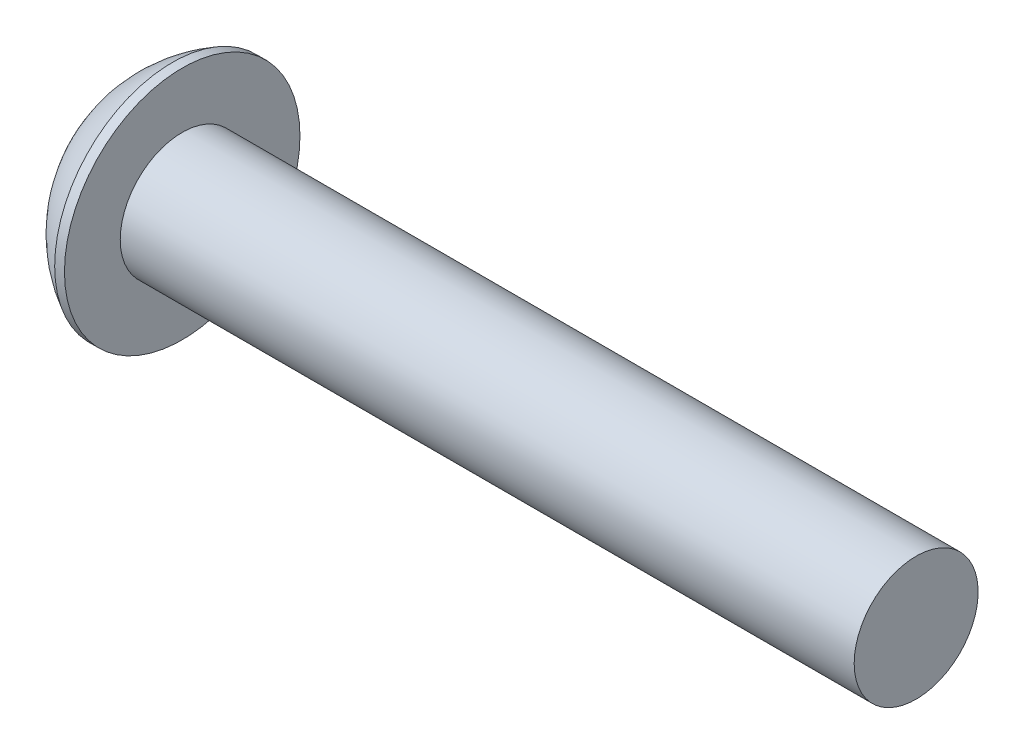
ISO-10303-21;
HEADER;
FILE_DESCRIPTION(('STEP AP214'),'2;1');
FILE_NAME('part.step','',(''),(''),'','','');
FILE_SCHEMA(('AUTOMOTIVE_DESIGN { 1 0 10303 214 1 1 1 1 }'));
ENDSEC;
DATA;
#1=APPLICATION_CONTEXT('core data for automotive mechanical design processes');
#2=APPLICATION_PROTOCOL_DEFINITION('international standard','automotive_design',2000,#1);
#3=PRODUCT_CONTEXT('',#1,'mechanical');
#4=PRODUCT('Part','Part','',(#3));
#5=PRODUCT_RELATED_PRODUCT_CATEGORY('part','',(#4));
#6=PRODUCT_DEFINITION_FORMATION('','',#4);
#7=PRODUCT_DEFINITION_CONTEXT('part definition',#1,'design');
#8=PRODUCT_DEFINITION('design','',#6,#7);
#9=PRODUCT_DEFINITION_SHAPE('','',#8);
#10=(LENGTH_UNIT() NAMED_UNIT(*) SI_UNIT(.MILLI.,.METRE.));
#11=(NAMED_UNIT(*) PLANE_ANGLE_UNIT() SI_UNIT($,.RADIAN.));
#12=(NAMED_UNIT(*) SI_UNIT($,.STERADIAN.) SOLID_ANGLE_UNIT());
#13=UNCERTAINTY_MEASURE_WITH_UNIT(LENGTH_MEASURE(1.E-05),#10,'distance_accuracy_value','');
#14=(GEOMETRIC_REPRESENTATION_CONTEXT(3) GLOBAL_UNCERTAINTY_ASSIGNED_CONTEXT((#13)) GLOBAL_UNIT_ASSIGNED_CONTEXT((#10,
#11,#12)) REPRESENTATION_CONTEXT('',''));
#15=CARTESIAN_POINT('',(0.,0.,0.));
#16=DIRECTION('',(0.,0.,1.));
#17=DIRECTION('',(1.,0.,0.));
#18=AXIS2_PLACEMENT_3D('',#15,#16,#17);
#19=CARTESIAN_POINT('',(-1.82880000000001,0.,0.));
#20=DIRECTION('',(-1.,0.,0.));
#21=DIRECTION('',(0.,0.,1.));
#22=AXIS2_PLACEMENT_3D('',#19,#20,#21);
#23=CONICAL_SURFACE('',#22,1.8288,0.785398163397446);
#24=CARTESIAN_POINT('',(-1.82880000000001,0.,0.));
#25=DIRECTION('',(-1.,0.,0.));
#26=DIRECTION('',(0.,0.,1.));
#27=AXIS2_PLACEMENT_3D('',#24,#25,#26);
#28=CIRCLE('',#27,1.8288);
#29=CARTESIAN_POINT('',(-1.82880000000001,-1.58004822109681,0.920845838894231));
#30=VERTEX_POINT('',#29);
#31=CARTESIAN_POINT('',(-1.82880000000001,-0.00745177890319401,1.82878481812136));
#32=VERTEX_POINT('',#31);
#33=EDGE_CURVE('E244',#30,#32,#28,.T.);
#34=ORIENTED_EDGE('',*,*,#33,.T.);
#35=CARTESIAN_POINT('',(-1.82900000000001,-0.00710296193273345,1.82898620769315));
#36=CARTESIAN_POINT('',(-1.79798176582111,-0.0612413968680546,1.79772936770974));
#37=CARTESIAN_POINT('',(-1.768804762154,-0.116280715119972,1.76595240250098));
#38=CARTESIAN_POINT('',(-1.71541731135211,-0.228486753173012,1.70117021622636));
#39=CARTESIAN_POINT('',(-1.6912359800132,-0.285663770827649,1.66815904969199));
#40=CARTESIAN_POINT('',(-1.64983313923053,-0.400953626097388,1.60159642071718));
#41=CARTESIAN_POINT('',(-1.63250927558265,-0.459038096623036,1.56806133602346));
#42=CARTESIAN_POINT('',(-1.60583796244815,-0.576464657697729,1.50026507937697));
#43=CARTESIAN_POINT('',(-1.59647107247955,-0.635803317985221,1.46600588788664));
#44=CARTESIAN_POINT('',(-1.58800887531627,-0.738427717920976,1.4067556629583));
#45=CARTESIAN_POINT('',(-1.58678086812113,-0.781586520417755,1.38183791671889));
#46=CARTESIAN_POINT('',(-1.58902398395721,-0.867829492194639,1.33204551374779));
#47=CARTESIAN_POINT('',(-1.59249673611106,-0.91091363041643,1.30717087494764));
#48=CARTESIAN_POINT('',(-1.60394206540771,-0.996659819496216,1.25766528960044));
#49=CARTESIAN_POINT('',(-1.61191838302761,-1.0393214894606,1.23303456296242));
#50=CARTESIAN_POINT('',(-1.63193840774461,-1.12392707655171,1.18418750448042));
#51=CARTESIAN_POINT('',(-1.6439838418413,-1.1658706809649,1.15997135318168));
#52=CARTESIAN_POINT('',(-1.67924043571692,-1.27185330769289,1.09878225511086));
#53=CARTESIAN_POINT('',(-1.70494165955475,-1.33527334252756,1.06216668092704));
#54=CARTESIAN_POINT('',(-1.74825503670668,-1.4285641683064,1.00830519755071));
#55=CARTESIAN_POINT('',(-1.76346130507454,-1.45931193774139,0.990552964590433));
#56=CARTESIAN_POINT('',(-1.79524996181871,-1.52025510962339,0.955367407899094));
#57=CARTESIAN_POINT('',(-1.8118317729839,-1.55045073733563,0.937933954111083));
#58=CARTESIAN_POINT('',(-1.82900000000027,-1.58039703806773,0.920644449322171));
#59=B_SPLINE_CURVE_WITH_KNOTS('',3,(#35,#36,#37,#38,#39,#40,#41,#42,#43,#44,#45,#46,#47,#48,#49,
#50,#51,#52,#53,#54,#55,#56,#57,#58),.UNSPECIFIED.,.F.,.F.,(4,2,2,2,2,2,2,2,2,2,2,4),(0.,
0.209500144466995,0.420188843332821,0.627602144749848,0.834507224341982,0.983847288144541,
1.13323912136536,1.28275521623455,1.43233484807212,1.66469982490852,1.78055165650198,
1.89635511741463),.UNSPECIFIED.);
#60=EDGE_CURVE('E214',#32,#30,#59,.T.);
#61=ORIENTED_EDGE('',*,*,#60,.T.);
#62=EDGE_LOOP('',(#34,#61));
#63=FACE_BOUND('',#62,.T.);
#64=ADVANCED_FACE('F41',(#63),#23,.F.);
#65=CARTESIAN_POINT('',(-1.82880000000001,-1.5875,-0.907938979227128));
#66=VERTEX_POINT('',#65);
#67=CARTESIAN_POINT('',(-1.82880000000001,-1.5875,0.907938979227128));
#68=VERTEX_POINT('',#67);
#69=EDGE_CURVE('E275',#66,#68,#28,.T.);
#70=ORIENTED_EDGE('',*,*,#69,.T.);
#71=CARTESIAN_POINT('',(-2.41884583359235,-1.5875,-1.82500929221936));
#72=CARTESIAN_POINT('',(-2.38531276542623,-1.5875,-1.78055818469936));
#73=CARTESIAN_POINT('',(-2.35210936835997,-1.5875,-1.73585907650942));
#74=CARTESIAN_POINT('',(-2.28649794756445,-1.5875,-1.64586427633954));
#75=CARTESIAN_POINT('',(-2.25409012601858,-1.5875,-1.600568437113));
#76=CARTESIAN_POINT('',(-2.15780190494498,-1.5875,-1.46297210215584));
#77=CARTESIAN_POINT('',(-2.09537319757193,-1.5875,-1.36963858857972));
#78=CARTESIAN_POINT('',(-1.97284516161749,-1.5875,-1.1739408617932));
#79=CARTESIAN_POINT('',(-1.91308014332863,-1.5875,-1.07136492019386));
#80=CARTESIAN_POINT('',(-1.80377603992626,-1.5875,-0.861093370178888));
#81=CARTESIAN_POINT('',(-1.75420248563308,-1.5875,-0.753416586787839));
#82=CARTESIAN_POINT('',(-1.69355473541147,-1.5875,-0.59176442890705));
#83=CARTESIAN_POINT('',(-1.67614346878425,-1.5875,-0.540176081947481));
#84=CARTESIAN_POINT('',(-1.64546298974417,-1.5875,-0.435756532214797));
#85=CARTESIAN_POINT('',(-1.63219406350996,-1.5875,-0.382925243842576));
#86=CARTESIAN_POINT('',(-1.61070764570342,-1.5875,-0.277216790300937));
#87=CARTESIAN_POINT('',(-1.60240378593419,-1.5875,-0.224357458354004));
#88=CARTESIAN_POINT('',(-1.59100915058537,-1.5875,-0.118076745851791));
#89=CARTESIAN_POINT('',(-1.58791748493136,-1.5875,-0.0646554628277626));
#90=CARTESIAN_POINT('',(-1.58717534074502,-1.5875,0.0403024254508756));
#91=CARTESIAN_POINT('',(-1.58933324549264,-1.5875,0.091837742427017));
#92=CARTESIAN_POINT('',(-1.59854919060368,-1.5875,0.194465290551352));
#93=CARTESIAN_POINT('',(-1.60560770796995,-1.5875,0.245557478077194));
#94=CARTESIAN_POINT('',(-1.62435975757509,-1.5875,0.347793759019247));
#95=CARTESIAN_POINT('',(-1.63613206364932,-1.5875,0.398923183857681));
#96=CARTESIAN_POINT('',(-1.66368690090293,-1.5875,0.500065247928145));
#97=CARTESIAN_POINT('',(-1.67946909288466,-1.5875,0.55007798123241));
#98=CARTESIAN_POINT('',(-1.73513369416259,-1.5875,0.707672888264433));
#99=CARTESIAN_POINT('',(-1.78136125535134,-1.5875,0.813008430509164));
#100=CARTESIAN_POINT('',(-1.88413869504212,-1.5875,1.01872985181378));
#101=CARTESIAN_POINT('',(-1.94072568595621,-1.5875,1.11909623158762));
#102=CARTESIAN_POINT('',(-2.05746539148359,-1.5875,1.31090882483437));
#103=CARTESIAN_POINT('',(-2.11730100937777,-1.5875,1.40255044446812));
#104=CARTESIAN_POINT('',(-2.20979890181475,-1.5875,1.53756602680818));
#105=CARTESIAN_POINT('',(-2.24095734379018,-1.5875,1.58198845986807));
#106=CARTESIAN_POINT('',(-2.30409778175578,-1.5875,1.67022633905771));
#107=CARTESIAN_POINT('',(-2.33607954894282,-1.5875,1.71404194872823));
#108=CARTESIAN_POINT('',(-2.36840270150048,-1.5875,1.75760493469799));
#109=B_SPLINE_CURVE_WITH_KNOTS('',3,(#71,#72,#73,#74,#75,#76,#77,#78,#79,#80,#81,#82,#83,#84,
#85,#86,#87,#88,#89,#90,#91,#92,#93,#94,#95,#96,#97,#98,#99,#100,#101,#102,#103,#104,#105,#106,
#107,#108),.UNSPECIFIED.,.F.,.F.,(4,2,2,2,2,2,2,2,2,2,2,2,2,2,2,2,2,2,4),(0.,0.167038582206584,
0.33411918424497,0.670830460170841,1.0266880706705,1.38132155981881,1.54452529826255,
1.70774030934245,1.86802667313751,2.02828566242478,2.18278328824718,2.33729595425851,
2.49450635071892,2.65170345312208,2.99578906555957,3.34113237629954,3.66930816833921,
3.83208342752259,3.99481392942941),.UNSPECIFIED.);
#110=EDGE_CURVE('E223',#68,#66,#109,.F.);
#111=ORIENTED_EDGE('',*,*,#110,.T.);
#112=EDGE_LOOP('',(#70,#111));
#113=FACE_BOUND('',#112,.T.);
#114=ADVANCED_FACE('F295',(#113),#23,.F.);
#115=CARTESIAN_POINT('',(-1.82880000000001,-0.00745177890319544,-1.82878481812136));
#116=VERTEX_POINT('',#115);
#117=CARTESIAN_POINT('',(-1.82880000000001,-1.5800482210968,-0.920845838894231));
#118=VERTEX_POINT('',#117);
#119=EDGE_CURVE('E267',#116,#118,#28,.T.);
#120=ORIENTED_EDGE('',*,*,#119,.T.);
#121=CARTESIAN_POINT('',(-1.82900000000027,-1.58039703806773,-0.92064444932217));
#122=CARTESIAN_POINT('',(-1.79798176582135,-1.52625860313238,-0.951901289305598));
#123=CARTESIAN_POINT('',(-1.76880476215421,-1.47121928488044,-0.983678254514372));
#124=CARTESIAN_POINT('',(-1.71541731135227,-1.35901324682734,-1.04846044078903));
#125=CARTESIAN_POINT('',(-1.69123598001333,-1.30183622917267,-1.08147160732341));
#126=CARTESIAN_POINT('',(-1.64983313923061,-1.18654637390287,-1.14803423629826));
#127=CARTESIAN_POINT('',(-1.63250927558271,-1.12846190337719,-1.181569320992));
#128=CARTESIAN_POINT('',(-1.60583796244818,-1.01103534230243,-1.24936557763853));
#129=CARTESIAN_POINT('',(-1.59647107247956,-0.951696682014903,-1.28362476912888));
#130=CARTESIAN_POINT('',(-1.58800887531627,-0.849072282079112,-1.34287499405724));
#131=CARTESIAN_POINT('',(-1.58678086812113,-0.805913479582333,-1.36779274029665));
#132=CARTESIAN_POINT('',(-1.58902398395721,-0.719670507805445,-1.41758514326775));
#133=CARTESIAN_POINT('',(-1.59249673611105,-0.676586369583652,-1.44245978206791));
#134=CARTESIAN_POINT('',(-1.6039420654077,-0.590840180503863,-1.49196536741511));
#135=CARTESIAN_POINT('',(-1.6119183830276,-0.548178510539482,-1.51659609405312));
#136=CARTESIAN_POINT('',(-1.63193840774459,-0.463572923448364,-1.56544315253513));
#137=CARTESIAN_POINT('',(-1.64398384184128,-0.42162931903517,-1.58965930383387));
#138=CARTESIAN_POINT('',(-1.67924043571687,-0.315646692307252,-1.65084840190465));
#139=CARTESIAN_POINT('',(-1.70494165955467,-0.252226657472646,-1.68746397608843));
#140=CARTESIAN_POINT('',(-1.74825503670654,-0.158935831693912,-1.7413254594647));
#141=CARTESIAN_POINT('',(-1.76346130507437,-0.128188062258946,-1.75907769242496));
#142=CARTESIAN_POINT('',(-1.79524996181849,-0.0672448903770135,-1.79426324911627));
#143=CARTESIAN_POINT('',(-1.81183177298366,-0.0370492626648058,-1.81169670290426));
#144=CARTESIAN_POINT('',(-1.82900000000001,-0.00710296193273376,-1.82898620769315));
#145=B_SPLINE_CURVE_WITH_KNOTS('',3,(#121,#122,#123,#124,#125,#126,#127,#128,#129,#130,#131,
#132,#133,#134,#135,#136,#137,#138,#139,#140,#141,#142,#143,#144),.UNSPECIFIED.,.F.,.F.,(4,2,2,
2,2,2,2,2,2,2,2,4),(0.,0.209500144467117,0.420188843333067,0.627602144750218,0.834507224342474,
0.983847288145038,1.13323912136587,1.28275521623506,1.43233484807263,1.66469982490878,
1.78055165650211,1.89635511741463),.UNSPECIFIED.);
#146=EDGE_CURVE('E273',#118,#116,#145,.T.);
#147=ORIENTED_EDGE('',*,*,#146,.T.);
#148=EDGE_LOOP('',(#120,#147));
#149=FACE_BOUND('',#148,.T.);
#150=ADVANCED_FACE('F272',(#149),#23,.F.);
#151=CARTESIAN_POINT('',(-1.82880000000001,1.5800482210968,-0.920845838894232));
#152=VERTEX_POINT('',#151);
#153=CARTESIAN_POINT('',(-1.82880000000001,0.00745177890319596,-1.82878481812136));
#154=VERTEX_POINT('',#153);
#155=EDGE_CURVE('E274',#152,#154,#28,.T.);
#156=ORIENTED_EDGE('',*,*,#155,.T.);
#157=CARTESIAN_POINT('',(-1.82900000000001,0.00710296193273401,-1.82898620769315));
#158=CARTESIAN_POINT('',(-1.79798176582111,0.0612413968680552,-1.79772936770974));
#159=CARTESIAN_POINT('',(-1.768804762154,0.116280715119972,-1.76595240250098));
#160=CARTESIAN_POINT('',(-1.71541731135211,0.228486753173013,-1.70117021622636));
#161=CARTESIAN_POINT('',(-1.6912359800132,0.28566377082765,-1.66815904969199));
#162=CARTESIAN_POINT('',(-1.64983313923053,0.40095362609739,-1.60159642071718));
#163=CARTESIAN_POINT('',(-1.63250927558265,0.459038096623037,-1.56806133602346));
#164=CARTESIAN_POINT('',(-1.60583796244815,0.57646465769773,-1.50026507937697));
#165=CARTESIAN_POINT('',(-1.59647107247955,0.635803317985223,-1.46600588788664));
#166=CARTESIAN_POINT('',(-1.58800887531627,0.738427717920978,-1.4067556629583));
#167=CARTESIAN_POINT('',(-1.58678086812113,0.781586520417756,-1.38183791671889));
#168=CARTESIAN_POINT('',(-1.58902398395721,0.86782949219464,-1.33204551374779));
#169=CARTESIAN_POINT('',(-1.59249673611106,0.910913630416431,-1.30717087494764));
#170=CARTESIAN_POINT('',(-1.60394206540771,0.996659819496218,-1.25766528960044));
#171=CARTESIAN_POINT('',(-1.61191838302761,1.0393214894606,-1.23303456296242));
#172=CARTESIAN_POINT('',(-1.63193840774461,1.12392707655171,-1.18418750448042));
#173=CARTESIAN_POINT('',(-1.6439838418413,1.1658706809649,-1.15997135318168));
#174=CARTESIAN_POINT('',(-1.67924043571692,1.27185330769289,-1.09878225511085));
#175=CARTESIAN_POINT('',(-1.70494165955476,1.33527334252757,-1.06216668092704));
#176=CARTESIAN_POINT('',(-1.74825503670668,1.4285641683064,-1.00830519755071));
#177=CARTESIAN_POINT('',(-1.76346130507454,1.45931193774139,-0.990552964590433));
#178=CARTESIAN_POINT('',(-1.79524996181871,1.52025510962339,-0.955367407899094));
#179=CARTESIAN_POINT('',(-1.8118317729839,1.55045073733563,-0.937933954111083));
#180=CARTESIAN_POINT('',(-1.82900000000027,1.58039703806773,-0.920644449322171));
#181=B_SPLINE_CURVE_WITH_KNOTS('',3,(#157,#158,#159,#160,#161,#162,#163,#164,#165,#166,#167,
#168,#169,#170,#171,#172,#173,#174,#175,#176,#177,#178,#179,#180),.UNSPECIFIED.,.F.,.F.,(4,2,2,
2,2,2,2,2,2,2,2,4),(0.,0.209500144466995,0.420188843332822,0.627602144749849,0.834507224341983,
0.983847288144542,1.13323912136536,1.28275521623455,1.43233484807213,1.66469982490853,
1.78055165650198,1.89635511741463),.UNSPECIFIED.);
#182=EDGE_CURVE('E310',#154,#152,#181,.T.);
#183=ORIENTED_EDGE('',*,*,#182,.T.);
#184=EDGE_LOOP('',(#156,#183));
#185=FACE_BOUND('',#184,.T.);
#186=ADVANCED_FACE('F292',(#185),#23,.F.);
#187=CARTESIAN_POINT('',(-1.82880000000001,1.5875,0.907938979227128));
#188=VERTEX_POINT('',#187);
#189=CARTESIAN_POINT('',(-1.82880000000001,1.5875,-0.907938979227127));
#190=VERTEX_POINT('',#189);
#191=EDGE_CURVE('E248',#188,#190,#28,.T.);
#192=ORIENTED_EDGE('',*,*,#191,.T.);
#193=CARTESIAN_POINT('',(-2.41884583359235,1.5875,-1.82500929221937));
#194=CARTESIAN_POINT('',(-2.38531276542623,1.5875,-1.78055818469936));
#195=CARTESIAN_POINT('',(-2.35210936835997,1.5875,-1.73585907650943));
#196=CARTESIAN_POINT('',(-2.28649794756445,1.5875,-1.64586427633954));
#197=CARTESIAN_POINT('',(-2.25409012601858,1.5875,-1.600568437113));
#198=CARTESIAN_POINT('',(-2.15780190494498,1.5875,-1.46297210215584));
#199=CARTESIAN_POINT('',(-2.09537319757193,1.5875,-1.36963858857972));
#200=CARTESIAN_POINT('',(-1.97284516161749,1.5875,-1.1739408617932));
#201=CARTESIAN_POINT('',(-1.91308014332863,1.5875,-1.07136492019386));
#202=CARTESIAN_POINT('',(-1.80377603992627,1.5875,-0.86109337017889));
#203=CARTESIAN_POINT('',(-1.75420248563308,1.5875,-0.75341658678784));
#204=CARTESIAN_POINT('',(-1.69355473541147,1.5875,-0.591764428907051));
#205=CARTESIAN_POINT('',(-1.67614346878425,1.5875,-0.540176081947481));
#206=CARTESIAN_POINT('',(-1.64546298974417,1.5875,-0.435756532214797));
#207=CARTESIAN_POINT('',(-1.63219406350996,1.5875,-0.382925243842576));
#208=CARTESIAN_POINT('',(-1.61070764570342,1.5875,-0.277216790300937));
#209=CARTESIAN_POINT('',(-1.60240378593419,1.5875,-0.224357458354004));
#210=CARTESIAN_POINT('',(-1.59100915058537,1.5875,-0.118076745851792));
#211=CARTESIAN_POINT('',(-1.58791748493136,1.5875,-0.0646554628277632));
#212=CARTESIAN_POINT('',(-1.58717534074502,1.5875,0.0403024254508752));
#213=CARTESIAN_POINT('',(-1.58933324549264,1.5875,0.0918377424270167));
#214=CARTESIAN_POINT('',(-1.59854919060368,1.5875,0.194465290551352));
#215=CARTESIAN_POINT('',(-1.60560770796995,1.5875,0.245557478077193));
#216=CARTESIAN_POINT('',(-1.62435975757509,1.5875,0.347793759019247));
#217=CARTESIAN_POINT('',(-1.63613206364932,1.5875,0.39892318385768));
#218=CARTESIAN_POINT('',(-1.66368690090293,1.5875,0.500065247928144));
#219=CARTESIAN_POINT('',(-1.67946909288466,1.5875,0.55007798123241));
#220=CARTESIAN_POINT('',(-1.73513369416259,1.5875,0.707672888264433));
#221=CARTESIAN_POINT('',(-1.78136125535134,1.5875,0.813008430509163));
#222=CARTESIAN_POINT('',(-1.88413869504212,1.5875,1.01872985181378));
#223=CARTESIAN_POINT('',(-1.94072568595621,1.5875,1.11909623158762));
#224=CARTESIAN_POINT('',(-2.05746539148359,1.5875,1.31090882483437));
#225=CARTESIAN_POINT('',(-2.11730100937777,1.5875,1.40255044446812));
#226=CARTESIAN_POINT('',(-2.20979890181475,1.5875,1.53756602680818));
#227=CARTESIAN_POINT('',(-2.24095734379018,1.5875,1.58198845986807));
#228=CARTESIAN_POINT('',(-2.30409778175578,1.5875,1.67022633905771));
#229=CARTESIAN_POINT('',(-2.33607954894282,1.5875,1.71404194872823));
#230=CARTESIAN_POINT('',(-2.36840270150048,1.5875,1.75760493469799));
#231=B_SPLINE_CURVE_WITH_KNOTS('',3,(#193,#194,#195,#196,#197,#198,#199,#200,#201,#202,#203,
#204,#205,#206,#207,#208,#209,#210,#211,#212,#213,#214,#215,#216,#217,#218,#219,#220,#221,#222,
#223,#224,#225,#226,#227,#228,#229,#230),.UNSPECIFIED.,.F.,.F.,(4,2,2,2,2,2,2,2,2,2,2,2,2,2,2,2,
2,2,4),(0.,0.167038582206583,0.334119184244971,0.670830460170842,1.0266880706705,
1.38132155981881,1.54452529826255,1.70774030934245,1.86802667313751,2.02828566242479,
2.18278328824719,2.33729595425851,2.49450635071892,2.65170345312209,2.99578906555957,
3.34113237629954,3.66930816833921,3.83208342752259,3.99481392942941),.UNSPECIFIED.);
#232=EDGE_CURVE('E194',#190,#188,#231,.T.);
#233=ORIENTED_EDGE('',*,*,#232,.T.);
#234=EDGE_LOOP('',(#192,#233));
#235=FACE_BOUND('',#234,.T.);
#236=ADVANCED_FACE('F286',(#235),#23,.F.);
#237=CARTESIAN_POINT('',(-1.82880000000001,0.00745177890319537,1.82878481812136));
#238=VERTEX_POINT('',#237);
#239=CARTESIAN_POINT('',(-1.82880000000001,1.58004822109681,0.920845838894231));
#240=VERTEX_POINT('',#239);
#241=EDGE_CURVE('E245',#238,#240,#28,.T.);
#242=ORIENTED_EDGE('',*,*,#241,.T.);
#243=CARTESIAN_POINT('',(-1.82900000000027,1.58039703806773,0.92064444932217));
#244=CARTESIAN_POINT('',(-1.79798176582135,1.52625860313238,0.951901289305598));
#245=CARTESIAN_POINT('',(-1.76880476215421,1.47121928488044,0.983678254514371));
#246=CARTESIAN_POINT('',(-1.71541731135227,1.35901324682734,1.04846044078903));
#247=CARTESIAN_POINT('',(-1.69123598001333,1.30183622917267,1.08147160732341));
#248=CARTESIAN_POINT('',(-1.64983313923061,1.18654637390287,1.14803423629826));
#249=CARTESIAN_POINT('',(-1.63250927558271,1.12846190337719,1.181569320992));
#250=CARTESIAN_POINT('',(-1.60583796244818,1.01103534230243,1.24936557763853));
#251=CARTESIAN_POINT('',(-1.59647107247956,0.951696682014904,1.28362476912888));
#252=CARTESIAN_POINT('',(-1.58800887531627,0.849072282079113,1.34287499405724));
#253=CARTESIAN_POINT('',(-1.58678086812113,0.805913479582333,1.36779274029665));
#254=CARTESIAN_POINT('',(-1.58902398395721,0.719670507805446,1.41758514326775));
#255=CARTESIAN_POINT('',(-1.59249673611105,0.676586369583653,1.44245978206791));
#256=CARTESIAN_POINT('',(-1.6039420654077,0.590840180503864,1.49196536741511));
#257=CARTESIAN_POINT('',(-1.6119183830276,0.548178510539483,1.51659609405312));
#258=CARTESIAN_POINT('',(-1.63193840774459,0.463572923448365,1.56544315253513));
#259=CARTESIAN_POINT('',(-1.64398384184128,0.421629319035171,1.58965930383387));
#260=CARTESIAN_POINT('',(-1.67924043571687,0.315646692307252,1.65084840190465));
#261=CARTESIAN_POINT('',(-1.70494165955467,0.252226657472647,1.68746397608843));
#262=CARTESIAN_POINT('',(-1.74825503670654,0.158935831693913,1.7413254594647));
#263=CARTESIAN_POINT('',(-1.76346130507437,0.128188062258947,1.75907769242496));
#264=CARTESIAN_POINT('',(-1.79524996181849,0.0672448903770139,1.79426324911627));
#265=CARTESIAN_POINT('',(-1.81183177298366,0.0370492626648061,1.81169670290426));
#266=CARTESIAN_POINT('',(-1.82900000000001,0.00710296193273415,1.82898620769315));
#267=B_SPLINE_CURVE_WITH_KNOTS('',3,(#243,#244,#245,#246,#247,#248,#249,#250,#251,#252,#253,
#254,#255,#256,#257,#258,#259,#260,#261,#262,#263,#264,#265,#266),.UNSPECIFIED.,.F.,.F.,(4,2,2,
2,2,2,2,2,2,2,2,4),(0.,0.209500144467116,0.420188843333066,0.627602144750218,0.834507224342473,
0.983847288145037,1.13323912136587,1.28275521623506,1.43233484807263,1.66469982490878,
1.78055165650211,1.89635511741463),.UNSPECIFIED.);
#268=EDGE_CURVE('E176',#240,#238,#267,.T.);
#269=ORIENTED_EDGE('',*,*,#268,.T.);
#270=EDGE_LOOP('',(#242,#269));
#271=FACE_BOUND('',#270,.T.);
#272=ADVANCED_FACE('F43',(#271),#23,.F.);
#273=CARTESIAN_POINT('',(-1.82880000000001,2.413,0.));
#274=DIRECTION('',(1.,0.,0.));
#275=DIRECTION('',(0.,0.,-1.));
#276=AXIS2_PLACEMENT_3D('',#273,#274,#275);
#277=PLANE('',#276);
#278=ORIENTED_EDGE('',*,*,#33,.F.);
#279=DIRECTION('',(0.,0.866025403784439,0.5));
#280=VECTOR('',#279,1.);
#281=CARTESIAN_POINT('',(-1.82880000000001,-1.5875,0.91654355233853));
#282=LINE('',#281,#280);
#283=CARTESIAN_POINT('',(-1.82880000000001,-1.5875,0.91654355233853));
#284=VERTEX_POINT('',#283);
#285=EDGE_CURVE('E165',#284,#30,#282,.T.);
#286=ORIENTED_EDGE('',*,*,#285,.F.);
#287=DIRECTION('',(0.,0.,-1.));
#288=VECTOR('',#287,1.);
#289=CARTESIAN_POINT('',(-1.82880000000001,-1.5875,0.));
#290=LINE('',#289,#288);
#291=EDGE_CURVE('E11',#284,#68,#290,.T.);
#292=ORIENTED_EDGE('',*,*,#291,.T.);
#293=ORIENTED_EDGE('',*,*,#69,.F.);
#294=DIRECTION('',(0.,0.,1.));
#295=VECTOR('',#294,1.);
#296=CARTESIAN_POINT('',(-1.82880000000001,-1.5875,-0.91654355233853));
#297=LINE('',#296,#295);
#298=CARTESIAN_POINT('',(-1.82880000000001,-1.5875,-0.91654355233853));
#299=VERTEX_POINT('',#298);
#300=EDGE_CURVE('E153',#299,#66,#297,.T.);
#301=ORIENTED_EDGE('',*,*,#300,.F.);
#302=DIRECTION('',(0.,0.866025403784439,-0.5));
#303=VECTOR('',#302,1.);
#304=CARTESIAN_POINT('',(-1.82880000000001,1.016,-2.41967497817372));
#305=LINE('',#304,#303);
#306=EDGE_CURVE('E50',#299,#118,#305,.T.);
#307=ORIENTED_EDGE('',*,*,#306,.T.);
#308=ORIENTED_EDGE('',*,*,#119,.F.);
#309=DIRECTION('',(0.,-0.866025403784438,0.5));
#310=VECTOR('',#309,1.);
#311=CARTESIAN_POINT('',(-1.82880000000001,0.,-1.83308710467706));
#312=LINE('',#311,#310);
#313=CARTESIAN_POINT('',(-1.82880000000001,0.,-1.83308710467706));
#314=VERTEX_POINT('',#313);
#315=EDGE_CURVE('E155',#314,#116,#312,.T.);
#316=ORIENTED_EDGE('',*,*,#315,.F.);
#317=DIRECTION('',(0.,0.866025403784439,0.5));
#318=VECTOR('',#317,1.);
#319=CARTESIAN_POINT('',(-1.82880000000001,2.6035,-0.329955678841872));
#320=LINE('',#319,#318);
#321=EDGE_CURVE('E256',#314,#154,#320,.T.);
#322=ORIENTED_EDGE('',*,*,#321,.T.);
#323=ORIENTED_EDGE('',*,*,#155,.F.);
#324=DIRECTION('',(0.,-0.866025403784438,-0.5));
#325=VECTOR('',#324,1.);
#326=CARTESIAN_POINT('',(-1.82880000000001,1.5875,-0.91654355233853));
#327=LINE('',#326,#325);
#328=CARTESIAN_POINT('',(-1.82880000000001,1.5875,-0.91654355233853));
#329=VERTEX_POINT('',#328);
#330=EDGE_CURVE('E171',#329,#152,#327,.T.);
#331=ORIENTED_EDGE('',*,*,#330,.F.);
#332=DIRECTION('',(0.,0.,1.));
#333=VECTOR('',#332,1.);
#334=CARTESIAN_POINT('',(-1.82880000000001,1.5875,0.));
#335=LINE('',#334,#333);
#336=EDGE_CURVE('E252',#329,#190,#335,.T.);
#337=ORIENTED_EDGE('',*,*,#336,.T.);
#338=ORIENTED_EDGE('',*,*,#191,.F.);
#339=DIRECTION('',(0.,0.,-1.));
#340=VECTOR('',#339,1.);
#341=CARTESIAN_POINT('',(-1.82880000000001,1.5875,0.91654355233853));
#342=LINE('',#341,#340);
#343=CARTESIAN_POINT('',(-1.82880000000001,1.5875,0.91654355233853));
#344=VERTEX_POINT('',#343);
#345=EDGE_CURVE('E169',#344,#188,#342,.T.);
#346=ORIENTED_EDGE('',*,*,#345,.F.);
#347=DIRECTION('',(0.,-0.866025403784438,0.5));
#348=VECTOR('',#347,1.);
#349=CARTESIAN_POINT('',(-1.82880000000001,2.6035,0.329955678841871));
#350=LINE('',#349,#348);
#351=EDGE_CURVE('E249',#344,#240,#350,.T.);
#352=ORIENTED_EDGE('',*,*,#351,.T.);
#353=ORIENTED_EDGE('',*,*,#241,.F.);
#354=DIRECTION('',(0.,0.866025403784438,-0.5));
#355=VECTOR('',#354,1.);
#356=CARTESIAN_POINT('',(-1.82880000000001,0.,1.83308710467706));
#357=LINE('',#356,#355);
#358=CARTESIAN_POINT('',(-1.82880000000001,0.,1.83308710467706));
#359=VERTEX_POINT('',#358);
#360=EDGE_CURVE('E167',#359,#238,#357,.T.);
#361=ORIENTED_EDGE('',*,*,#360,.F.);
#362=DIRECTION('',(0.,-0.866025403784439,-0.5));
#363=VECTOR('',#362,1.);
#364=CARTESIAN_POINT('',(-1.82880000000001,1.016,2.41967497817372));
#365=LINE('',#364,#363);
#366=EDGE_CURVE('E136',#359,#32,#365,.T.);
#367=ORIENTED_EDGE('',*,*,#366,.T.);
#368=EDGE_LOOP('',(#278,#286,#292,#293,#301,#307,#308,#316,#322,#323,#331,#337,#338,#346,#352,
#353,#361,#367));
#369=FACE_BOUND('',#368,.T.);
#370=CARTESIAN_POINT('',(-1.82880000000001,0.,0.));
#371=DIRECTION('',(-1.,0.,0.));
#372=DIRECTION('',(0.,0.,1.));
#373=AXIS2_PLACEMENT_3D('',#370,#371,#372);
#374=CIRCLE('',#373,2.413);
#375=CARTESIAN_POINT('',(-1.82880000000001,0.,2.413));
#376=VERTEX_POINT('',#375);
#377=EDGE_CURVE('E241',#376,#376,#374,.T.);
#378=ORIENTED_EDGE('',*,*,#377,.T.);
#379=EDGE_LOOP('',(#378));
#380=FACE_BOUND('',#379,.T.);
#381=ADVANCED_FACE('F264',(#369,#380),#277,.F.);
#382=CARTESIAN_POINT('',(2.75154317616325,0.,0.));
#383=DIRECTION('',(-1.,0.,0.));
#384=DIRECTION('',(0.,0.,1.));
#385=AXIS2_PLACEMENT_3D('',#382,#383,#384);
#386=DEGENERATE_TOROIDAL_SURFACE('',#385,0.00969167426947842,5.1816,.F.);
#387=ORIENTED_EDGE('',*,*,#377,.F.);
#388=EDGE_LOOP('',(#387));
#389=FACE_BOUND('',#388,.T.);
#390=CARTESIAN_POINT('',(0.355599999999993,0.,0.));
#391=DIRECTION('',(-1.,0.,0.));
#392=DIRECTION('',(0.,0.,1.));
#393=AXIS2_PLACEMENT_3D('',#390,#391,#392);
#394=CIRCLE('',#393,4.5847);
#395=CARTESIAN_POINT('',(0.355599999999993,0.,4.5847));
#396=VERTEX_POINT('',#395);
#397=EDGE_CURVE('E238',#396,#396,#394,.T.);
#398=ORIENTED_EDGE('',*,*,#397,.T.);
#399=EDGE_LOOP('',(#398));
#400=FACE_BOUND('',#399,.T.);
#401=ADVANCED_FACE('F291',(#389,#400),#386,.F.);
#402=CARTESIAN_POINT('',(0.,0.,0.));
#403=DIRECTION('',(-1.,0.,0.));
#404=DIRECTION('',(0.,0.,1.));
#405=AXIS2_PLACEMENT_3D('',#402,#403,#404);
#406=CYLINDRICAL_SURFACE('',#405,4.5847);
#407=ORIENTED_EDGE('',*,*,#397,.F.);
#408=EDGE_LOOP('',(#407));
#409=FACE_BOUND('',#408,.T.);
#410=CARTESIAN_POINT('',(0.736599999999993,0.,0.));
#411=DIRECTION('',(-1.,0.,0.));
#412=DIRECTION('',(0.,0.,1.));
#413=AXIS2_PLACEMENT_3D('',#410,#411,#412);
#414=CIRCLE('',#413,4.5847);
#415=CARTESIAN_POINT('',(0.736599999999993,0.,4.5847));
#416=VERTEX_POINT('',#415);
#417=EDGE_CURVE('E235',#416,#416,#414,.T.);
#418=ORIENTED_EDGE('',*,*,#417,.T.);
#419=EDGE_LOOP('',(#418));
#420=FACE_BOUND('',#419,.T.);
#421=ADVANCED_FACE('F389',(#409,#420),#406,.T.);
#422=CARTESIAN_POINT('',(0.736599999999993,2.413,0.));
#423=DIRECTION('',(-1.,0.,0.));
#424=DIRECTION('',(0.,0.,1.));
#425=AXIS2_PLACEMENT_3D('',#422,#423,#424);
#426=PLANE('',#425);
#427=ORIENTED_EDGE('',*,*,#417,.F.);
#428=EDGE_LOOP('',(#427));
#429=FACE_BOUND('',#428,.T.);
#430=CARTESIAN_POINT('',(0.736599999999993,0.,0.));
#431=DIRECTION('',(-1.,0.,0.));
#432=DIRECTION('',(0.,0.,1.));
#433=AXIS2_PLACEMENT_3D('',#430,#431,#432);
#434=CIRCLE('',#433,2.413);
#435=CARTESIAN_POINT('',(0.736599999999993,0.,2.413));
#436=VERTEX_POINT('',#435);
#437=EDGE_CURVE('E232',#436,#436,#434,.T.);
#438=ORIENTED_EDGE('',*,*,#437,.T.);
#439=EDGE_LOOP('',(#438));
#440=FACE_BOUND('',#439,.T.);
#441=ADVANCED_FACE('F382',(#429,#440),#426,.F.);
#442=CARTESIAN_POINT('',(0.,0.,0.));
#443=DIRECTION('',(-1.,0.,0.));
#444=DIRECTION('',(0.,0.,1.));
#445=AXIS2_PLACEMENT_3D('',#442,#443,#444);
#446=CYLINDRICAL_SURFACE('',#445,2.413);
#447=ORIENTED_EDGE('',*,*,#437,.F.);
#448=EDGE_LOOP('',(#447));
#449=FACE_BOUND('',#448,.T.);
#450=CARTESIAN_POINT('',(29.3116,0.,0.));
#451=DIRECTION('',(-1.,0.,0.));
#452=DIRECTION('',(0.,0.,1.));
#453=AXIS2_PLACEMENT_3D('',#450,#451,#452);
#454=CIRCLE('',#453,2.413);
#455=CARTESIAN_POINT('',(29.3116,0.,2.413));
#456=VERTEX_POINT('',#455);
#457=EDGE_CURVE('E222',#456,#456,#454,.T.);
#458=ORIENTED_EDGE('',*,*,#457,.T.);
#459=EDGE_LOOP('',(#458));
#460=FACE_BOUND('',#459,.T.);
#461=ADVANCED_FACE('F374',(#449,#460),#446,.T.);
#462=CARTESIAN_POINT('',(29.3116,0.,0.));
#463=DIRECTION('',(-1.,0.,0.));
#464=DIRECTION('',(0.,0.,1.));
#465=AXIS2_PLACEMENT_3D('',#462,#463,#464);
#466=PLANE('',#465);
#467=ORIENTED_EDGE('',*,*,#457,.F.);
#468=EDGE_LOOP('',(#467));
#469=FACE_BOUND('',#468,.T.);
#470=ADVANCED_FACE('F211',(#469),#466,.F.);
#471=CARTESIAN_POINT('',(0.,-1.5875,0.91654355233853));
#472=DIRECTION('',(0.,-0.5,0.866025403784439));
#473=DIRECTION('',(0.,-0.866025403784439,-0.5));
#474=AXIS2_PLACEMENT_3D('',#471,#472,#473);
#475=PLANE('',#474);
#476=ORIENTED_EDGE('',*,*,#366,.F.);
#477=DIRECTION('',(-1.,0.,0.));
#478=VECTOR('',#477,1.);
#479=CARTESIAN_POINT('',(0.,0.,1.83308710467706));
#480=LINE('',#479,#478);
#481=CARTESIAN_POINT('',(0.,0.,1.83308710467706));
#482=VERTEX_POINT('',#481);
#483=EDGE_CURVE('E57',#482,#359,#480,.T.);
#484=ORIENTED_EDGE('',*,*,#483,.F.);
#485=DIRECTION('',(0.,0.866025403784439,0.5));
#486=VECTOR('',#485,1.);
#487=CARTESIAN_POINT('',(0.,-1.5875,0.91654355233853));
#488=LINE('',#487,#486);
#489=CARTESIAN_POINT('',(0.,-1.5875,0.91654355233853));
#490=VERTEX_POINT('',#489);
#491=EDGE_CURVE('E133',#490,#482,#488,.T.);
#492=ORIENTED_EDGE('',*,*,#491,.F.);
#493=DIRECTION('',(-1.,0.,0.));
#494=VECTOR('',#493,1.);
#495=CARTESIAN_POINT('',(0.,-1.5875,0.91654355233853));
#496=LINE('',#495,#494);
#497=EDGE_CURVE('E174',#490,#284,#496,.T.);
#498=ORIENTED_EDGE('',*,*,#497,.T.);
#499=ORIENTED_EDGE('',*,*,#285,.T.);
#500=ORIENTED_EDGE('',*,*,#60,.F.);
#501=EDGE_LOOP('',(#476,#484,#492,#498,#499,#500));
#502=FACE_BOUND('',#501,.T.);
#503=ADVANCED_FACE('F130',(#502),#475,.F.);
#504=CARTESIAN_POINT('',(0.,-1.5875,-0.91654355233853));
#505=DIRECTION('',(0.,-1.,0.));
#506=DIRECTION('',(0.,0.,-1.));
#507=AXIS2_PLACEMENT_3D('',#504,#505,#506);
#508=PLANE('',#507);
#509=ORIENTED_EDGE('',*,*,#291,.F.);
#510=ORIENTED_EDGE('',*,*,#497,.F.);
#511=DIRECTION('',(0.,0.,1.));
#512=VECTOR('',#511,1.);
#513=CARTESIAN_POINT('',(0.,-1.5875,-0.91654355233853));
#514=LINE('',#513,#512);
#515=CARTESIAN_POINT('',(0.,-1.5875,-0.91654355233853));
#516=VERTEX_POINT('',#515);
#517=EDGE_CURVE('E139',#516,#490,#514,.T.);
#518=ORIENTED_EDGE('',*,*,#517,.F.);
#519=DIRECTION('',(-1.,0.,0.));
#520=VECTOR('',#519,1.);
#521=CARTESIAN_POINT('',(0.,-1.5875,-0.91654355233853));
#522=LINE('',#521,#520);
#523=EDGE_CURVE('E177',#516,#299,#522,.T.);
#524=ORIENTED_EDGE('',*,*,#523,.T.);
#525=ORIENTED_EDGE('',*,*,#300,.T.);
#526=ORIENTED_EDGE('',*,*,#110,.F.);
#527=EDGE_LOOP('',(#509,#510,#518,#524,#525,#526));
#528=FACE_BOUND('',#527,.T.);
#529=ADVANCED_FACE('F210',(#528),#508,.F.);
#530=CARTESIAN_POINT('',(0.,0.,-1.83308710467706));
#531=DIRECTION('',(0.,-0.5,-0.866025403784438));
#532=DIRECTION('',(0.,0.866025403784439,-0.5));
#533=AXIS2_PLACEMENT_3D('',#530,#531,#532);
#534=PLANE('',#533);
#535=ORIENTED_EDGE('',*,*,#306,.F.);
#536=ORIENTED_EDGE('',*,*,#523,.F.);
#537=DIRECTION('',(0.,-0.866025403784438,0.5));
#538=VECTOR('',#537,1.);
#539=CARTESIAN_POINT('',(0.,0.,-1.83308710467706));
#540=LINE('',#539,#538);
#541=CARTESIAN_POINT('',(0.,0.,-1.83308710467706));
#542=VERTEX_POINT('',#541);
#543=EDGE_CURVE('E162',#542,#516,#540,.T.);
#544=ORIENTED_EDGE('',*,*,#543,.F.);
#545=DIRECTION('',(-1.,0.,0.));
#546=VECTOR('',#545,1.);
#547=CARTESIAN_POINT('',(0.,0.,-1.83308710467706));
#548=LINE('',#547,#546);
#549=EDGE_CURVE('E180',#542,#314,#548,.T.);
#550=ORIENTED_EDGE('',*,*,#549,.T.);
#551=ORIENTED_EDGE('',*,*,#315,.T.);
#552=ORIENTED_EDGE('',*,*,#146,.F.);
#553=EDGE_LOOP('',(#535,#536,#544,#550,#551,#552));
#554=FACE_BOUND('',#553,.T.);
#555=ADVANCED_FACE('F316',(#554),#534,.F.);
#556=CARTESIAN_POINT('',(0.,1.5875,-0.91654355233853));
#557=DIRECTION('',(0.,0.5,-0.866025403784439));
#558=DIRECTION('',(0.,0.866025403784439,0.5));
#559=AXIS2_PLACEMENT_3D('',#556,#557,#558);
#560=PLANE('',#559);
#561=ORIENTED_EDGE('',*,*,#321,.F.);
#562=ORIENTED_EDGE('',*,*,#549,.F.);
#563=DIRECTION('',(0.,-0.866025403784438,-0.5));
#564=VECTOR('',#563,1.);
#565=CARTESIAN_POINT('',(0.,1.5875,-0.91654355233853));
#566=LINE('',#565,#564);
#567=CARTESIAN_POINT('',(0.,1.5875,-0.91654355233853));
#568=VERTEX_POINT('',#567);
#569=EDGE_CURVE('E159',#568,#542,#566,.T.);
#570=ORIENTED_EDGE('',*,*,#569,.F.);
#571=DIRECTION('',(-1.,0.,0.));
#572=VECTOR('',#571,1.);
#573=CARTESIAN_POINT('',(0.,1.5875,-0.91654355233853));
#574=LINE('',#573,#572);
#575=EDGE_CURVE('E183',#568,#329,#574,.T.);
#576=ORIENTED_EDGE('',*,*,#575,.T.);
#577=ORIENTED_EDGE('',*,*,#330,.T.);
#578=ORIENTED_EDGE('',*,*,#182,.F.);
#579=EDGE_LOOP('',(#561,#562,#570,#576,#577,#578));
#580=FACE_BOUND('',#579,.T.);
#581=ADVANCED_FACE('F313',(#580),#560,.F.);
#582=CARTESIAN_POINT('',(0.,1.5875,0.91654355233853));
#583=DIRECTION('',(0.,1.,0.));
#584=DIRECTION('',(0.,0.,1.));
#585=AXIS2_PLACEMENT_3D('',#582,#583,#584);
#586=PLANE('',#585);
#587=ORIENTED_EDGE('',*,*,#336,.F.);
#588=ORIENTED_EDGE('',*,*,#575,.F.);
#589=DIRECTION('',(0.,0.,-1.));
#590=VECTOR('',#589,1.);
#591=CARTESIAN_POINT('',(0.,1.5875,0.91654355233853));
#592=LINE('',#591,#590);
#593=CARTESIAN_POINT('',(0.,1.5875,0.91654355233853));
#594=VERTEX_POINT('',#593);
#595=EDGE_CURVE('E148',#594,#568,#592,.T.);
#596=ORIENTED_EDGE('',*,*,#595,.F.);
#597=DIRECTION('',(-1.,0.,0.));
#598=VECTOR('',#597,1.);
#599=CARTESIAN_POINT('',(0.,1.5875,0.91654355233853));
#600=LINE('',#599,#598);
#601=EDGE_CURVE('E138',#594,#344,#600,.T.);
#602=ORIENTED_EDGE('',*,*,#601,.T.);
#603=ORIENTED_EDGE('',*,*,#345,.T.);
#604=ORIENTED_EDGE('',*,*,#232,.F.);
#605=EDGE_LOOP('',(#587,#588,#596,#602,#603,#604));
#606=FACE_BOUND('',#605,.T.);
#607=ADVANCED_FACE('F204',(#606),#586,.F.);
#608=CARTESIAN_POINT('',(0.,0.,1.83308710467706));
#609=DIRECTION('',(0.,0.5,0.866025403784438));
#610=DIRECTION('',(0.,-0.866025403784438,0.5));
#611=AXIS2_PLACEMENT_3D('',#608,#609,#610);
#612=PLANE('',#611);
#613=ORIENTED_EDGE('',*,*,#351,.F.);
#614=ORIENTED_EDGE('',*,*,#601,.F.);
#615=DIRECTION('',(0.,0.866025403784438,-0.5));
#616=VECTOR('',#615,1.);
#617=CARTESIAN_POINT('',(0.,0.,1.83308710467706));
#618=LINE('',#617,#616);
#619=EDGE_CURVE('E142',#482,#594,#618,.T.);
#620=ORIENTED_EDGE('',*,*,#619,.F.);
#621=ORIENTED_EDGE('',*,*,#483,.T.);
#622=ORIENTED_EDGE('',*,*,#360,.T.);
#623=ORIENTED_EDGE('',*,*,#268,.F.);
#624=EDGE_LOOP('',(#613,#614,#620,#621,#622,#623));
#625=FACE_BOUND('',#624,.T.);
#626=ADVANCED_FACE('F143',(#625),#612,.F.);
#627=CARTESIAN_POINT('',(0.,0.,0.));
#628=DIRECTION('',(-1.,0.,0.));
#629=DIRECTION('',(0.,0.,1.));
#630=AXIS2_PLACEMENT_3D('',#627,#628,#629);
#631=PLANE('',#630);
#632=CARTESIAN_POINT('',(0.,0.,0.));
#633=VERTEX_POINT('',#632);
#634=VERTEX_LOOP('',#633);
#635=FACE_BOUND('',#634,.T.);
#636=ORIENTED_EDGE('',*,*,#491,.T.);
#637=ORIENTED_EDGE('',*,*,#619,.T.);
#638=ORIENTED_EDGE('',*,*,#595,.T.);
#639=ORIENTED_EDGE('',*,*,#569,.T.);
#640=ORIENTED_EDGE('',*,*,#543,.T.);
#641=ORIENTED_EDGE('',*,*,#517,.T.);
#642=EDGE_LOOP('',(#636,#637,#638,#639,#640,#641));
#643=FACE_BOUND('',#642,.T.);
#644=ADVANCED_FACE('F150',(#635,#643),#631,.T.);
#645=CLOSED_SHELL('',(#64,#114,#150,#186,#236,#272,#381,#401,#421,#441,#461,#470,#503,#529,#555,
#581,#607,#626,#644));
#646=MANIFOLD_SOLID_BREP('B2',#645);
#647=ADVANCED_BREP_SHAPE_REPRESENTATION('',(#18,#646),#14);
#648=SHAPE_DEFINITION_REPRESENTATION(#9,#647);
ENDSEC;
END-ISO-10303-21;
